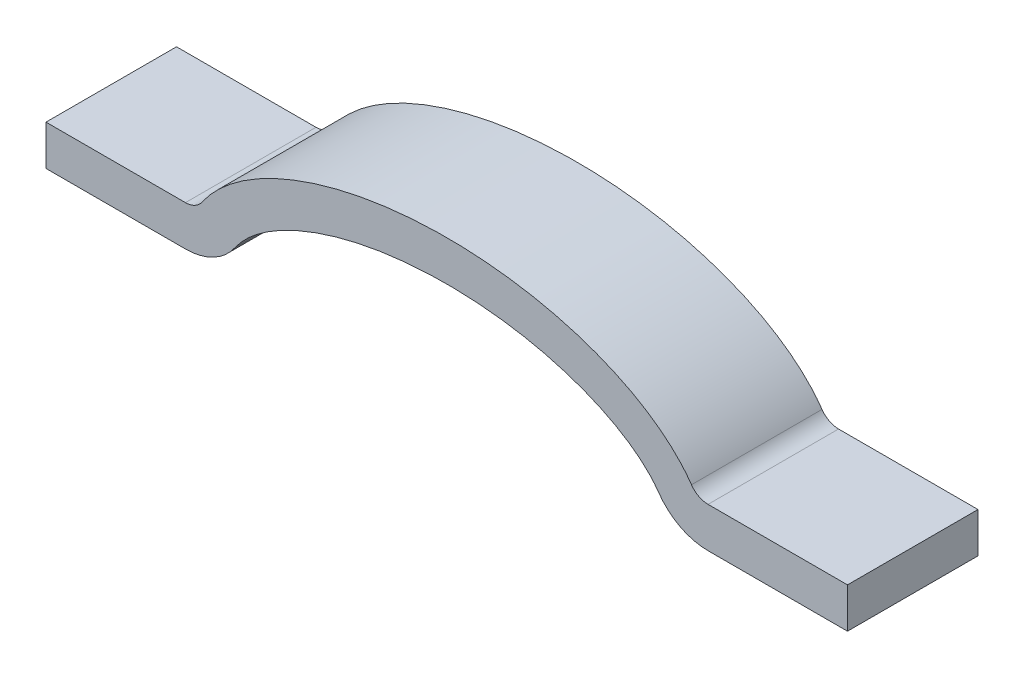
ISO-10303-21;
HEADER;
FILE_DESCRIPTION(('STEP AP214'),'2;1');
FILE_NAME('part.step','',(''),(''),'','','');
FILE_SCHEMA(('AUTOMOTIVE_DESIGN { 1 0 10303 214 1 1 1 1 }'));
ENDSEC;
DATA;
#1=APPLICATION_CONTEXT('core data for automotive mechanical design processes');
#2=APPLICATION_PROTOCOL_DEFINITION('international standard','automotive_design',2000,#1);
#3=PRODUCT_CONTEXT('',#1,'mechanical');
#4=PRODUCT('Part','Part','',(#3));
#5=PRODUCT_RELATED_PRODUCT_CATEGORY('part','',(#4));
#6=PRODUCT_DEFINITION_FORMATION('','',#4);
#7=PRODUCT_DEFINITION_CONTEXT('part definition',#1,'design');
#8=PRODUCT_DEFINITION('design','',#6,#7);
#9=PRODUCT_DEFINITION_SHAPE('','',#8);
#10=(LENGTH_UNIT() NAMED_UNIT(*) SI_UNIT(.MILLI.,.METRE.));
#11=(NAMED_UNIT(*) PLANE_ANGLE_UNIT() SI_UNIT($,.RADIAN.));
#12=(NAMED_UNIT(*) SI_UNIT($,.STERADIAN.) SOLID_ANGLE_UNIT());
#13=UNCERTAINTY_MEASURE_WITH_UNIT(LENGTH_MEASURE(1.E-05),#10,'distance_accuracy_value','');
#14=(GEOMETRIC_REPRESENTATION_CONTEXT(3) GLOBAL_UNCERTAINTY_ASSIGNED_CONTEXT((#13)) GLOBAL_UNIT_ASSIGNED_CONTEXT((#10,
#11,#12)) REPRESENTATION_CONTEXT('',''));
#15=CARTESIAN_POINT('',(0.,0.,0.));
#16=DIRECTION('',(0.,0.,1.));
#17=DIRECTION('',(1.,0.,0.));
#18=AXIS2_PLACEMENT_3D('',#15,#16,#17);
#19=CARTESIAN_POINT('',(39.9161860349977,0.,13.));
#20=DIRECTION('',(1.,0.,0.));
#21=DIRECTION('',(0.,0.,-1.));
#22=AXIS2_PLACEMENT_3D('',#19,#20,#21);
#23=PLANE('',#22);
#24=DIRECTION('',(0.,-1.,0.));
#25=VECTOR('',#24,1.);
#26=CARTESIAN_POINT('',(39.9161860349977,0.,0.));
#27=LINE('',#26,#25);
#28=CARTESIAN_POINT('',(39.9161860349977,4.,0.));
#29=VERTEX_POINT('',#28);
#30=CARTESIAN_POINT('',(39.9161860349977,0.,0.));
#31=VERTEX_POINT('',#30);
#32=EDGE_CURVE('E11',#29,#31,#27,.T.);
#33=ORIENTED_EDGE('',*,*,#32,.F.);
#34=DIRECTION('',(0.,0.,1.));
#35=VECTOR('',#34,1.);
#36=CARTESIAN_POINT('',(39.9161860349977,4.,13.));
#37=LINE('',#36,#35);
#38=CARTESIAN_POINT('',(39.9161860349977,4.,13.));
#39=VERTEX_POINT('',#38);
#40=EDGE_CURVE('E108',#39,#29,#37,.F.);
#41=ORIENTED_EDGE('',*,*,#40,.F.);
#42=DIRECTION('',(0.,-1.,0.));
#43=VECTOR('',#42,1.);
#44=CARTESIAN_POINT('',(39.9161860349977,0.,13.));
#45=LINE('',#44,#43);
#46=CARTESIAN_POINT('',(39.9161860349977,0.,13.));
#47=VERTEX_POINT('',#46);
#48=EDGE_CURVE('E46',#39,#47,#45,.T.);
#49=ORIENTED_EDGE('',*,*,#48,.T.);
#50=DIRECTION('',(0.,0.,-1.));
#51=VECTOR('',#50,1.);
#52=CARTESIAN_POINT('',(39.9161860349977,0.,13.));
#53=LINE('',#52,#51);
#54=EDGE_CURVE('E140',#47,#31,#53,.T.);
#55=ORIENTED_EDGE('',*,*,#54,.T.);
#56=EDGE_LOOP('',(#33,#41,#49,#55));
#57=FACE_BOUND('',#56,.T.);
#58=ADVANCED_FACE('F37',(#57),#23,.T.);
#59=CARTESIAN_POINT('',(-22.,0.,13.));
#60=DIRECTION('',(0.,0.,1.));
#61=DIRECTION('',(1.,0.,0.));
#62=AXIS2_PLACEMENT_3D('',#59,#60,#61);
#63=PLANE('',#62);
#64=DIRECTION('',(1.,0.,0.));
#65=VECTOR('',#64,1.);
#66=CARTESIAN_POINT('',(-22.,0.,13.));
#67=LINE('',#66,#65);
#68=CARTESIAN_POINT('',(-39.9161860349977,0.,13.));
#69=VERTEX_POINT('',#68);
#70=CARTESIAN_POINT('',(-26.0263948261629,0.,13.));
#71=VERTEX_POINT('',#70);
#72=EDGE_CURVE('E163',#69,#71,#67,.T.);
#73=ORIENTED_EDGE('',*,*,#72,.T.);
#74=CARTESIAN_POINT('',(-26.0263948261629,5.99999999999997,13.));
#75=DIRECTION('',(0.,0.,-1.));
#76=DIRECTION('',(-1.,0.,0.));
#77=AXIS2_PLACEMENT_3D('',#74,#75,#76);
#78=CIRCLE('',#77,6.);
#79=CARTESIAN_POINT('',(-21.083393892477,2.59900870780584,13.));
#80=VERTEX_POINT('',#79);
#81=EDGE_CURVE('E54',#71,#80,#78,.F.);
#82=ORIENTED_EDGE('',*,*,#81,.T.);
#83=CARTESIAN_POINT('',(-22.,0.,13.));
#84=CARTESIAN_POINT('',(-22.,0.432036641839711,13.));
#85=CARTESIAN_POINT('',(-21.8548863619666,1.29610992551914,13.));
#86=CARTESIAN_POINT('',(-20.9973878430744,2.88664464705841,13.));
#87=CARTESIAN_POINT('',(-19.2580049467167,4.66938679657808,13.));
#88=CARTESIAN_POINT('',(-15.7412521676776,6.99878575691308,13.));
#89=CARTESIAN_POINT('',(-9.3643610379705,9.3281522587363,13.));
#90=CARTESIAN_POINT('',(0.,10.3359238706319,13.));
#91=CARTESIAN_POINT('',(9.36436103797051,9.3281522587363,13.));
#92=CARTESIAN_POINT('',(15.7412521676776,6.99878575691308,13.));
#93=CARTESIAN_POINT('',(19.2580049467167,4.66938679657808,13.));
#94=CARTESIAN_POINT('',(20.9973878430744,2.8866446470584,13.));
#95=CARTESIAN_POINT('',(21.8548863619666,1.29610992551914,13.));
#96=CARTESIAN_POINT('',(22.,0.432036641839715,13.));
#97=CARTESIAN_POINT('',(22.,0.,13.));
#98=B_SPLINE_CURVE_WITH_KNOTS('',3,(#83,#84,#85,#86,#87,#88,#89,#90,#91,#92,#93,#94,#95,#96,
#97),.UNSPECIFIED.,.F.,.F.,(4,1,1,1,1,1,1,1,1,1,1,1,4),(3.14159265358979,3.33794219443916,
3.53429173528852,3.73064127613788,3.92699081698724,4.31968989868597,4.71238898038469,
5.10508806208341,5.49778714378214,5.6941366846315,5.89048622548086,6.08683576633022,
6.28318530717959),.UNSPECIFIED.);
#99=CARTESIAN_POINT('',(21.083393892477,2.59900870780584,13.));
#100=VERTEX_POINT('',#99);
#101=EDGE_CURVE('E164',#80,#100,#98,.T.);
#102=ORIENTED_EDGE('',*,*,#101,.T.);
#103=CARTESIAN_POINT('',(26.0263948261629,5.99999999999997,13.));
#104=DIRECTION('',(0.,0.,-1.));
#105=DIRECTION('',(-1.,0.,0.));
#106=AXIS2_PLACEMENT_3D('',#103,#104,#105);
#107=CIRCLE('',#106,6.);
#108=CARTESIAN_POINT('',(26.0263948261629,0.,13.));
#109=VERTEX_POINT('',#108);
#110=EDGE_CURVE('E161',#100,#109,#107,.F.);
#111=ORIENTED_EDGE('',*,*,#110,.T.);
#112=DIRECTION('',(1.,0.,0.));
#113=VECTOR('',#112,1.);
#114=CARTESIAN_POINT('',(22.,0.,13.));
#115=LINE('',#114,#113);
#116=EDGE_CURVE('E152',#109,#47,#115,.T.);
#117=ORIENTED_EDGE('',*,*,#116,.T.);
#118=ORIENTED_EDGE('',*,*,#48,.F.);
#119=DIRECTION('',(-1.,0.,0.));
#120=VECTOR('',#119,1.);
#121=CARTESIAN_POINT('',(22.,4.,13.));
#122=LINE('',#121,#120);
#123=CARTESIAN_POINT('',(26.0263948261629,4.,13.));
#124=VERTEX_POINT('',#123);
#125=EDGE_CURVE('E232',#124,#39,#122,.F.);
#126=ORIENTED_EDGE('',*,*,#125,.F.);
#127=CARTESIAN_POINT('',(26.0263948261629,5.99999999999997,13.));
#128=DIRECTION('',(0.,0.,-1.));
#129=DIRECTION('',(-1.,0.,0.));
#130=AXIS2_PLACEMENT_3D('',#127,#128,#129);
#131=CIRCLE('',#130,2.);
#132=CARTESIAN_POINT('',(24.3787278482676,4.86633623593526,13.));
#133=VERTEX_POINT('',#132);
#134=EDGE_CURVE('E103',#133,#124,#131,.F.);
#135=ORIENTED_EDGE('',*,*,#134,.F.);
#136=CARTESIAN_POINT('',(-26.,-5.25591541948676E-09,13.));
#137=CARTESIAN_POINT('',(-26.0000116676451,0.111537247286349,13.));
#138=CARTESIAN_POINT('',(-25.9976258289216,0.223078285323674,13.));
#139=CARTESIAN_POINT('',(-25.9878872850968,0.448666430823199,13.));
#140=CARTESIAN_POINT('',(-25.9804149655458,0.56270837405115,13.));
#141=CARTESIAN_POINT('',(-25.9601396738284,0.792413314224165,13.));
#142=CARTESIAN_POINT('',(-25.9472420470309,0.908067983077297,13.));
#143=CARTESIAN_POINT('',(-25.915945897434,1.14006903279323,13.));
#144=CARTESIAN_POINT('',(-25.8974821013963,1.25640660479358,13.));
#145=CARTESIAN_POINT('',(-25.8550595671101,1.48888395466193,13.));
#146=CARTESIAN_POINT('',(-25.8310646704827,1.6050171275041,13.));
#147=CARTESIAN_POINT('',(-25.7777484707093,1.83630999130887,13.));
#148=CARTESIAN_POINT('',(-25.7484160494636,1.95146711504999,13.));
#149=CARTESIAN_POINT('',(-25.6847150602839,2.18020284317876,13.));
#150=CARTESIAN_POINT('',(-25.6503536260085,2.29378343805561,13.));
#151=CARTESIAN_POINT('',(-25.576956710448,2.51896209143195,13.));
#152=CARTESIAN_POINT('',(-25.5379387429657,2.63056587201652,13.));
#153=CARTESIAN_POINT('',(-25.4552024021435,2.85270133325781,13.));
#154=CARTESIAN_POINT('',(-25.4114597755304,2.96322396550021,13.));
#155=CARTESIAN_POINT('',(-25.3189473938992,3.18415346660159,13.));
#156=CARTESIAN_POINT('',(-25.2701104006534,3.2945321547338,13.));
#157=CARTESIAN_POINT('',(-25.1674048004263,3.5150226557403,13.));
#158=CARTESIAN_POINT('',(-25.1134695287242,3.62510338377648,13.));
#159=CARTESIAN_POINT('',(-25.0005687603073,3.84486090717794,13.));
#160=CARTESIAN_POINT('',(-24.9415371214083,3.9545036889688,13.));
#161=CARTESIAN_POINT('',(-24.8184478876507,4.17326325245095,13.));
#162=CARTESIAN_POINT('',(-24.7543245859132,4.28234302730507,13.));
#163=CARTESIAN_POINT('',(-24.6210568142596,4.49987062809492,13.));
#164=CARTESIAN_POINT('',(-24.551846981188,4.60827837147226,13.));
#165=CARTESIAN_POINT('',(-24.4084091092638,4.82437233822117,13.));
#166=CARTESIAN_POINT('',(-24.3341159707699,4.93201530889777,13.));
#167=CARTESIAN_POINT('',(-24.1805098064464,5.1465060090048,13.));
#168=CARTESIAN_POINT('',(-24.1011318763264,5.25330721555847,13.));
#169=CARTESIAN_POINT('',(-23.9376358793378,5.465685050551,13.));
#170=CARTESIAN_POINT('',(-23.8534658733088,5.57122165086724,13.));
#171=CARTESIAN_POINT('',(-23.6806810325843,5.78080997511271,13.));
#172=CARTESIAN_POINT('',(-23.5920238340478,5.88482672709309,13.));
#173=CARTESIAN_POINT('',(-23.4102450544272,6.09150776484632,13.));
#174=CARTESIAN_POINT('',(-23.3170780484472,6.19413207563363,13.));
#175=CARTESIAN_POINT('',(-23.1262558984359,6.39810968013806,13.));
#176=CARTESIAN_POINT('',(-23.0285536250027,6.49941876570225,13.));
#177=CARTESIAN_POINT('',(-22.7261165515322,6.80408823826286,13.));
#178=CARTESIAN_POINT('',(-22.5167459416307,7.00287359830188,13.));
#179=CARTESIAN_POINT('',(-22.0798868853556,7.39575577415625,13.));
#180=CARTESIAN_POINT('',(-21.8520176546229,7.58942688279915,13.));
#181=CARTESIAN_POINT('',(-21.3789946630926,7.97090126508661,13.));
#182=CARTESIAN_POINT('',(-21.13351925821,8.15830480213568,13.));
#183=CARTESIAN_POINT('',(-20.6264401691121,8.52651690174705,13.));
#184=CARTESIAN_POINT('',(-20.3645738543199,8.7069625142317,13.));
#185=CARTESIAN_POINT('',(-19.8247588027536,9.06125072564397,13.));
#186=CARTESIAN_POINT('',(-19.546563156856,9.2347161911291,13.));
#187=CARTESIAN_POINT('',(-18.9741946965365,9.57474769189839,13.));
#188=CARTESIAN_POINT('',(-18.6797941952976,9.74092968282077,13.));
#189=CARTESIAN_POINT('',(-18.0763789806,10.0652540159631,13.));
#190=CARTESIAN_POINT('',(-17.7671841379604,10.2230603717114,13.));
#191=CARTESIAN_POINT('',(-17.1358146082921,10.5301159281395,13.));
#192=CARTESIAN_POINT('',(-16.8135048236157,10.6790864692833,13.));
#193=CARTESIAN_POINT('',(-16.1563567979412,10.9685343106685,13.));
#194=CARTESIAN_POINT('',(-15.8214002132375,11.1087422747537,13.));
#195=CARTESIAN_POINT('',(-15.1394655070584,11.380573016466,13.));
#196=CARTESIAN_POINT('',(-14.7923851076409,11.5119386431155,13.));
#197=CARTESIAN_POINT('',(-14.086757023152,11.7658746909795,13.));
#198=CARTESIAN_POINT('',(-13.7281218143803,11.88820144439,13.));
#199=CARTESIAN_POINT('',(-12.9999804917653,12.1237597026379,13.));
#200=CARTESIAN_POINT('',(-12.6304001582384,12.2367614083769,13.));
#201=CARTESIAN_POINT('',(-11.8810004293432,12.4532996975759,13.));
#202=CARTESIAN_POINT('',(-11.501118686008,12.5566202125045,13.));
#203=CARTESIAN_POINT('',(-10.7317776314485,12.7533690968808,13.));
#204=CARTESIAN_POINT('',(-10.3422665196632,12.846594671185,13.));
#205=CARTESIAN_POINT('',(-9.55512700269836,13.0225123751248,13.));
#206=CARTESIAN_POINT('',(-9.15746143610106,13.1050381251034,13.));
#207=CARTESIAN_POINT('',(-8.35560256669944,13.2593762182577,13.));
#208=CARTESIAN_POINT('',(-7.95138522936855,13.331062741599,13.));
#209=CARTESIAN_POINT('',(-6.72488526673784,13.5309431058362,13.));
#210=CARTESIAN_POINT('',(-5.89967836668501,13.6415405098872,13.));
#211=CARTESIAN_POINT('',(-4.23333341247432,13.8198639361473,13.));
#212=CARTESIAN_POINT('',(-3.39213171827096,13.8869837014631,13.));
#213=CARTESIAN_POINT('',(-1.70063272261015,13.9772291723469,13.));
#214=CARTESIAN_POINT('',(-0.850316361305075,14.,13.));
#215=CARTESIAN_POINT('',(0.850316361304433,14.,13.));
#216=CARTESIAN_POINT('',(1.70063272260886,13.977229172347,13.));
#217=CARTESIAN_POINT('',(3.39213171826967,13.8869837014632,13.));
#218=CARTESIAN_POINT('',(4.23333341247369,13.8198639361473,13.));
#219=CARTESIAN_POINT('',(5.89967836667695,13.6415405098881,13.));
#220=CARTESIAN_POINT('',(6.72488526672175,13.5309431058383,13.));
#221=CARTESIAN_POINT('',(7.95138522934303,13.3310627416034,13.));
#222=CARTESIAN_POINT('',(8.35560256667242,13.2593762182626,13.));
#223=CARTESIAN_POINT('',(9.15746143609327,13.1050381251052,13.));
#224=CARTESIAN_POINT('',(9.55512700271117,13.0225123751223,13.));
#225=CARTESIAN_POINT('',(10.342266519711,12.846594671174,13.));
#226=CARTESIAN_POINT('',(10.7317776315108,12.7533690968658,13.));
#227=CARTESIAN_POINT('',(11.5011186860734,12.556620212487,13.));
#228=CARTESIAN_POINT('',(11.8810004293976,12.4532996975607,13.));
#229=CARTESIAN_POINT('',(12.6304001582672,12.2367614083681,13.));
#230=CARTESIAN_POINT('',(12.9999804917797,12.1237597026333,13.));
#231=CARTESIAN_POINT('',(13.7281218143619,11.888201444396,13.));
#232=CARTESIAN_POINT('',(14.0867570231153,11.7658746909921,13.));
#233=CARTESIAN_POINT('',(14.7923851076046,11.5119386431292,13.));
#234=CARTESIAN_POINT('',(15.1394655070404,11.3805730164732,13.));
#235=CARTESIAN_POINT('',(15.8214002133122,11.1087422747239,13.));
#236=CARTESIAN_POINT('',(16.1563567980896,10.9685343106064,13.));
#237=CARTESIAN_POINT('',(16.8135048237357,10.6790864692273,13.));
#238=CARTESIAN_POINT('',(17.1358146083127,10.5301159281282,13.));
#239=CARTESIAN_POINT('',(17.7671841378536,10.2230603717646,13.));
#240=CARTESIAN_POINT('',(18.0763789804637,10.0652540160334,13.));
#241=CARTESIAN_POINT('',(18.6797941951791,9.74092968288742,13.));
#242=CARTESIAN_POINT('',(18.9741946964635,9.57474769194123,13.));
#243=CARTESIAN_POINT('',(19.5465631567266,9.23471619120654,13.));
#244=CARTESIAN_POINT('',(19.8247588025261,9.06125072578613,13.));
#245=CARTESIAN_POINT('',(20.3645738540333,8.70696251442677,13.));
#246=CARTESIAN_POINT('',(20.6264401688605,8.52651690192429,13.));
#247=CARTESIAN_POINT('',(21.1335192580166,8.1583048022814,13.));
#248=CARTESIAN_POINT('',(21.3789946629229,7.97090126521917,13.));
#249=CARTESIAN_POINT('',(21.8520176544375,7.58942688295277,13.));
#250=CARTESIAN_POINT('',(22.0798868851335,7.3957557743473,13.));
#251=CARTESIAN_POINT('',(22.5167459416699,7.00287359827503,13.));
#252=CARTESIAN_POINT('',(22.7261165518533,6.80408823796273,13.));
#253=CARTESIAN_POINT('',(23.0285536251686,6.49941876552382,13.));
#254=CARTESIAN_POINT('',(23.126255898194,6.3981096803828,13.));
#255=CARTESIAN_POINT('',(23.3170780480187,6.19413207610534,13.));
#256=CARTESIAN_POINT('',(23.4102450542003,6.09150776510358,13.));
#257=CARTESIAN_POINT('',(23.5920238341204,5.88482672701131,13.));
#258=CARTESIAN_POINT('',(23.6806810327581,5.78080997490921,13.));
#259=CARTESIAN_POINT('',(23.8534658733679,5.5712216507883,13.));
#260=CARTESIAN_POINT('',(23.9376358791933,5.4656850507284,13.));
#261=CARTESIAN_POINT('',(24.1011318761151,5.25330721584322,13.));
#262=CARTESIAN_POINT('',(24.1805098063578,5.14650600912951,13.));
#263=CARTESIAN_POINT('',(24.3341159706946,4.93201530900185,13.));
#264=CARTESIAN_POINT('',(24.40840910909,4.82437233847237,13.));
#265=CARTESIAN_POINT('',(24.5518469807964,4.60827837207256,13.));
#266=CARTESIAN_POINT('',(24.6210568137503,4.49987062889827,13.));
#267=CARTESIAN_POINT('',(24.7543245855127,4.28234302798651,13.));
#268=CARTESIAN_POINT('',(24.8184478874569,4.17326325279536,13.));
#269=CARTESIAN_POINT('',(24.9415371216399,3.95450368855732,13.));
#270=CARTESIAN_POINT('',(25.000568760755,3.84486090634631,13.));
#271=CARTESIAN_POINT('',(25.1134695291365,3.62510338293474,13.));
#272=CARTESIAN_POINT('',(25.1674048006193,3.51502265532528,13.));
#273=CARTESIAN_POINT('',(25.2701104007492,3.29453215452878,13.));
#274=CARTESIAN_POINT('',(25.3189473940913,3.18415346616786,13.));
#275=CARTESIAN_POINT('',(25.4114597756033,2.96322396530142,13.));
#276=CARTESIAN_POINT('',(25.4552024020288,2.85270133353429,13.));
#277=CARTESIAN_POINT('',(25.5379387427875,2.63056587252623,13.));
#278=CARTESIAN_POINT('',(25.5769567103644,2.51896209168857,13.));
#279=CARTESIAN_POINT('',(25.6503536260101,2.29378343805051,13.));
#280=CARTESIAN_POINT('',(25.684715060287,2.18020284316853,13.));
#281=CARTESIAN_POINT('',(25.7484160493808,1.95146711534656,13.));
#282=CARTESIAN_POINT('',(25.7777484705532,1.83630999192129,13.));
#283=CARTESIAN_POINT('',(25.83106467028,1.60501712844776,13.));
#284=CARTESIAN_POINT('',(25.8550595669203,1.48888395561773,13.));
#285=CARTESIAN_POINT('',(25.8974821012935,1.25640660544136,13.));
#286=CARTESIAN_POINT('',(25.9159458973902,1.14006903311805,13.));
#287=CARTESIAN_POINT('',(25.9472420469846,0.908067983421301,13.));
#288=CARTESIAN_POINT('',(25.9601396737515,0.792413314914489,13.));
#289=CARTESIAN_POINT('',(25.9804149655618,0.562708374048563,13.));
#290=CARTESIAN_POINT('',(25.9878872851732,0.448666429775861,13.));
#291=CARTESIAN_POINT('',(25.9976258289061,0.223078284976777,13.));
#292=CARTESIAN_POINT('',(26.0000116675999,0.111537248689892,13.));
#293=CARTESIAN_POINT('',(26.,-2.10236242051774E-09,13.));
#294=B_SPLINE_CURVE_WITH_KNOTS('',3,(#136,#137,#138,#139,#140,#141,#142,#143,#144,#145,#146,
#147,#148,#149,#150,#151,#152,#153,#154,#155,#156,#157,#158,#159,#160,#161,#162,#163,#164,#165,
#166,#167,#168,#169,#170,#171,#172,#173,#174,#175,#176,#177,#178,#179,#180,#181,#182,#183,#184,
#185,#186,#187,#188,#189,#190,#191,#192,#193,#194,#195,#196,#197,#198,#199,#200,#201,#202,#203,
#204,#205,#206,#207,#208,#209,#210,#211,#212,#213,#214,#215,#216,#217,#218,#219,#220,#221,#222,
#223,#224,#225,#226,#227,#228,#229,#230,#231,#232,#233,#234,#235,#236,#237,#238,#239,#240,#241,
#242,#243,#244,#245,#246,#247,#248,#249,#250,#251,#252,#253,#254,#255,#256,#257,#258,#259,#260,
#261,#262,#263,#264,#265,#266,#267,#268,#269,#270,#271,#272,#273,#274,#275,#276,#277,#278,#279,
#280,#281,#282,#283,#284,#285,#286,#287,#288,#289,#290,#291,#292,#293),.UNSPECIFIED.,.F.,.F.,(4,
2,2,2,2,2,2,2,2,2,2,2,2,2,2,2,2,2,2,2,2,2,2,2,2,2,2,2,2,2,2,2,2,2,2,2,2,2,2,2,2,2,2,2,2,2,2,2,2,
2,2,2,2,2,2,2,2,2,2,2,2,2,2,2,2,2,2,2,2,2,2,2,2,2,2,2,2,2,4),(0.,0.334591789746542,
0.677336812858055,1.02632737627372,1.37958114205443,1.73521322792134,2.09159475891316,
2.44747557596909,2.80205773509361,3.1585553708871,3.52056192024408,3.88822160551874,
4.26170458649938,4.64121147442852,5.02697649710909,5.41926944722264,5.8183965570049,
6.22329407200158,6.63324503470354,7.04899786213921,7.47118101830255,8.33679232254686,
9.2335334475586,10.1596351408929,11.1133345604709,12.0965467306585,13.1104308997004,
14.1515568356346,15.2165209576283,16.3056441657962,17.4187588005548,18.5553293801477,
19.7145470935532,20.8954045060722,22.0967554563243,23.3149837249181,24.5464165421089,
27.0427967760967,29.5732773915513,32.1239249127651,34.6745724339769,37.2050530494334,
39.7014332833969,40.932866100583,42.15109436924,43.352445319537,44.5333027320222,
45.6925204453825,46.8290910249172,47.9422056597339,49.031328868143,50.0962929898102,
51.1374189256425,52.1513030948383,53.1345152646738,54.0882146843685,55.014316377783,
55.9110575026386,56.7766688080581,57.1988519624594,57.6146047907775,58.024555753954,
58.4294532679691,58.8285803783557,59.2208733279385,59.6066383499161,59.9861452390305,
60.3596282214272,60.7272879052643,61.0892944553647,61.4457920896268,61.8003742495608,
62.1562550666327,62.512636596653,62.8682686824921,63.2215224492561,63.5705130116307,
63.9132580378779,64.247849822377),.UNSPECIFIED.);
#295=CARTESIAN_POINT('',(-24.3787278482676,4.86633623593526,13.));
#296=VERTEX_POINT('',#295);
#297=EDGE_CURVE('E227',#296,#133,#294,.T.);
#298=ORIENTED_EDGE('',*,*,#297,.F.);
#299=CARTESIAN_POINT('',(-26.0263948261629,5.99999999999997,13.));
#300=DIRECTION('',(0.,0.,-1.));
#301=DIRECTION('',(-1.,0.,0.));
#302=AXIS2_PLACEMENT_3D('',#299,#300,#301);
#303=CIRCLE('',#302,2.);
#304=CARTESIAN_POINT('',(-26.0263948261629,3.99999999999997,13.));
#305=VERTEX_POINT('',#304);
#306=EDGE_CURVE('E233',#305,#296,#303,.F.);
#307=ORIENTED_EDGE('',*,*,#306,.F.);
#308=DIRECTION('',(-1.,0.,0.));
#309=VECTOR('',#308,1.);
#310=CARTESIAN_POINT('',(-22.,4.,13.));
#311=LINE('',#310,#309);
#312=CARTESIAN_POINT('',(-39.9161860349977,4.,13.));
#313=VERTEX_POINT('',#312);
#314=EDGE_CURVE('E241',#313,#305,#311,.F.);
#315=ORIENTED_EDGE('',*,*,#314,.F.);
#316=DIRECTION('',(0.,-1.,0.));
#317=VECTOR('',#316,1.);
#318=CARTESIAN_POINT('',(-39.9161860349977,0.,13.));
#319=LINE('',#318,#317);
#320=EDGE_CURVE('E132',#313,#69,#319,.T.);
#321=ORIENTED_EDGE('',*,*,#320,.T.);
#322=EDGE_LOOP('',(#73,#82,#102,#111,#117,#118,#126,#135,#298,#307,#315,#321));
#323=FACE_BOUND('',#322,.T.);
#324=ADVANCED_FACE('F159',(#323),#63,.T.);
#325=CARTESIAN_POINT('',(-39.9161860349977,0.,13.));
#326=DIRECTION('',(1.,0.,0.));
#327=DIRECTION('',(0.,0.,-1.));
#328=AXIS2_PLACEMENT_3D('',#325,#326,#327);
#329=PLANE('',#328);
#330=ORIENTED_EDGE('',*,*,#320,.F.);
#331=DIRECTION('',(0.,0.,1.));
#332=VECTOR('',#331,1.);
#333=CARTESIAN_POINT('',(-39.9161860349977,4.,13.));
#334=LINE('',#333,#332);
#335=CARTESIAN_POINT('',(-39.9161860349977,4.,0.));
#336=VERTEX_POINT('',#335);
#337=EDGE_CURVE('E242',#313,#336,#334,.F.);
#338=ORIENTED_EDGE('',*,*,#337,.T.);
#339=DIRECTION('',(0.,-1.,0.));
#340=VECTOR('',#339,1.);
#341=CARTESIAN_POINT('',(-39.9161860349977,0.,0.));
#342=LINE('',#341,#340);
#343=CARTESIAN_POINT('',(-39.9161860349977,0.,0.));
#344=VERTEX_POINT('',#343);
#345=EDGE_CURVE('E129',#336,#344,#342,.T.);
#346=ORIENTED_EDGE('',*,*,#345,.T.);
#347=DIRECTION('',(0.,0.,-1.));
#348=VECTOR('',#347,1.);
#349=CARTESIAN_POINT('',(-39.9161860349977,0.,13.));
#350=LINE('',#349,#348);
#351=EDGE_CURVE('E157',#69,#344,#350,.T.);
#352=ORIENTED_EDGE('',*,*,#351,.F.);
#353=EDGE_LOOP('',(#330,#338,#346,#352));
#354=FACE_BOUND('',#353,.T.);
#355=ADVANCED_FACE('F267',(#354),#329,.F.);
#356=CARTESIAN_POINT('',(26.0263948261629,5.99999999999997,0.));
#357=DIRECTION('',(0.,0.,1.));
#358=DIRECTION('',(1.,0.,0.));
#359=AXIS2_PLACEMENT_3D('',#356,#357,#358);
#360=PLANE('',#359);
#361=CARTESIAN_POINT('',(26.0263948261629,5.99999999999997,0.));
#362=DIRECTION('',(0.,0.,-1.));
#363=DIRECTION('',(-1.,0.,0.));
#364=AXIS2_PLACEMENT_3D('',#361,#362,#363);
#365=CIRCLE('',#364,2.);
#366=CARTESIAN_POINT('',(26.0263948261629,3.99999999999997,0.));
#367=VERTEX_POINT('',#366);
#368=CARTESIAN_POINT('',(24.3787278482676,4.86633623593526,0.));
#369=VERTEX_POINT('',#368);
#370=EDGE_CURVE('E100',#367,#369,#365,.T.);
#371=ORIENTED_EDGE('',*,*,#370,.F.);
#372=DIRECTION('',(-1.,0.,0.));
#373=VECTOR('',#372,1.);
#374=CARTESIAN_POINT('',(22.,4.,0.));
#375=LINE('',#374,#373);
#376=EDGE_CURVE('E112',#367,#29,#375,.F.);
#377=ORIENTED_EDGE('',*,*,#376,.T.);
#378=ORIENTED_EDGE('',*,*,#32,.T.);
#379=DIRECTION('',(1.,0.,0.));
#380=VECTOR('',#379,1.);
#381=CARTESIAN_POINT('',(22.,0.,0.));
#382=LINE('',#381,#380);
#383=CARTESIAN_POINT('',(26.0263948261629,0.,0.));
#384=VERTEX_POINT('',#383);
#385=EDGE_CURVE('E155',#384,#31,#382,.T.);
#386=ORIENTED_EDGE('',*,*,#385,.F.);
#387=CARTESIAN_POINT('',(26.0263948261629,5.99999999999997,0.));
#388=DIRECTION('',(0.,0.,-1.));
#389=DIRECTION('',(-1.,0.,0.));
#390=AXIS2_PLACEMENT_3D('',#387,#388,#389);
#391=CIRCLE('',#390,6.);
#392=CARTESIAN_POINT('',(21.083393892477,2.59900870780584,0.));
#393=VERTEX_POINT('',#392);
#394=EDGE_CURVE('E188',#384,#393,#391,.T.);
#395=ORIENTED_EDGE('',*,*,#394,.T.);
#396=CARTESIAN_POINT('',(-22.,0.,0.));
#397=CARTESIAN_POINT('',(-22.,0.432036641839711,0.));
#398=CARTESIAN_POINT('',(-21.8548863619666,1.29610992551914,0.));
#399=CARTESIAN_POINT('',(-20.9973878430744,2.88664464705841,0.));
#400=CARTESIAN_POINT('',(-19.2580049467167,4.66938679657808,0.));
#401=CARTESIAN_POINT('',(-15.7412521676776,6.99878575691308,0.));
#402=CARTESIAN_POINT('',(-9.3643610379705,9.3281522587363,0.));
#403=CARTESIAN_POINT('',(0.,10.3359238706319,0.));
#404=CARTESIAN_POINT('',(9.36436103797051,9.3281522587363,0.));
#405=CARTESIAN_POINT('',(15.7412521676776,6.99878575691308,0.));
#406=CARTESIAN_POINT('',(19.2580049467167,4.66938679657808,0.));
#407=CARTESIAN_POINT('',(20.9973878430744,2.8866446470584,0.));
#408=CARTESIAN_POINT('',(21.8548863619666,1.29610992551914,0.));
#409=CARTESIAN_POINT('',(22.,0.432036641839715,0.));
#410=CARTESIAN_POINT('',(22.,0.,0.));
#411=B_SPLINE_CURVE_WITH_KNOTS('',3,(#396,#397,#398,#399,#400,#401,#402,#403,#404,#405,#406,
#407,#408,#409,#410),.UNSPECIFIED.,.F.,.F.,(4,1,1,1,1,1,1,1,1,1,1,1,4),(3.14159265358979,
3.33794219443916,3.53429173528852,3.73064127613788,3.92699081698724,4.31968989868597,
4.71238898038469,5.10508806208341,5.49778714378214,5.6941366846315,5.89048622548086,
6.08683576633022,6.28318530717959),.UNSPECIFIED.);
#412=CARTESIAN_POINT('',(-21.083393892477,2.59900870780584,0.));
#413=VERTEX_POINT('',#412);
#414=EDGE_CURVE('E170',#413,#393,#411,.T.);
#415=ORIENTED_EDGE('',*,*,#414,.F.);
#416=CARTESIAN_POINT('',(-26.0263948261629,5.99999999999997,0.));
#417=DIRECTION('',(0.,0.,-1.));
#418=DIRECTION('',(-1.,0.,0.));
#419=AXIS2_PLACEMENT_3D('',#416,#417,#418);
#420=CIRCLE('',#419,6.);
#421=CARTESIAN_POINT('',(-26.0263948261629,0.,0.));
#422=VERTEX_POINT('',#421);
#423=EDGE_CURVE('E185',#413,#422,#420,.T.);
#424=ORIENTED_EDGE('',*,*,#423,.T.);
#425=DIRECTION('',(1.,0.,0.));
#426=VECTOR('',#425,1.);
#427=CARTESIAN_POINT('',(-22.,0.,0.));
#428=LINE('',#427,#426);
#429=EDGE_CURVE('E167',#344,#422,#428,.T.);
#430=ORIENTED_EDGE('',*,*,#429,.F.);
#431=ORIENTED_EDGE('',*,*,#345,.F.);
#432=DIRECTION('',(-1.,0.,0.));
#433=VECTOR('',#432,1.);
#434=CARTESIAN_POINT('',(-22.,4.,0.));
#435=LINE('',#434,#433);
#436=CARTESIAN_POINT('',(-26.0263948261629,4.,0.));
#437=VERTEX_POINT('',#436);
#438=EDGE_CURVE('E116',#336,#437,#435,.F.);
#439=ORIENTED_EDGE('',*,*,#438,.T.);
#440=CARTESIAN_POINT('',(-26.0263948261629,5.99999999999997,0.));
#441=DIRECTION('',(0.,0.,-1.));
#442=DIRECTION('',(-1.,0.,0.));
#443=AXIS2_PLACEMENT_3D('',#440,#441,#442);
#444=CIRCLE('',#443,2.);
#445=CARTESIAN_POINT('',(-24.3787278482676,4.86633623593526,0.));
#446=VERTEX_POINT('',#445);
#447=EDGE_CURVE('E107',#446,#437,#444,.T.);
#448=ORIENTED_EDGE('',*,*,#447,.F.);
#449=CARTESIAN_POINT('',(-26.,-5.25591541948676E-09,0.));
#450=CARTESIAN_POINT('',(-26.0000116676451,0.111537247286349,0.));
#451=CARTESIAN_POINT('',(-25.9976258289216,0.223078285323674,0.));
#452=CARTESIAN_POINT('',(-25.9878872850968,0.448666430823199,0.));
#453=CARTESIAN_POINT('',(-25.9804149655458,0.56270837405115,0.));
#454=CARTESIAN_POINT('',(-25.9601396738284,0.792413314224165,0.));
#455=CARTESIAN_POINT('',(-25.9472420470309,0.908067983077297,0.));
#456=CARTESIAN_POINT('',(-25.915945897434,1.14006903279323,0.));
#457=CARTESIAN_POINT('',(-25.8974821013963,1.25640660479358,0.));
#458=CARTESIAN_POINT('',(-25.8550595671101,1.48888395466193,0.));
#459=CARTESIAN_POINT('',(-25.8310646704827,1.6050171275041,0.));
#460=CARTESIAN_POINT('',(-25.7777484707093,1.83630999130887,0.));
#461=CARTESIAN_POINT('',(-25.7484160494636,1.95146711504999,0.));
#462=CARTESIAN_POINT('',(-25.6847150602839,2.18020284317876,0.));
#463=CARTESIAN_POINT('',(-25.6503536260085,2.29378343805561,0.));
#464=CARTESIAN_POINT('',(-25.576956710448,2.51896209143195,0.));
#465=CARTESIAN_POINT('',(-25.5379387429657,2.63056587201652,0.));
#466=CARTESIAN_POINT('',(-25.4552024021435,2.85270133325781,0.));
#467=CARTESIAN_POINT('',(-25.4114597755304,2.96322396550021,0.));
#468=CARTESIAN_POINT('',(-25.3189473938992,3.18415346660159,0.));
#469=CARTESIAN_POINT('',(-25.2701104006534,3.2945321547338,0.));
#470=CARTESIAN_POINT('',(-25.1674048004263,3.5150226557403,0.));
#471=CARTESIAN_POINT('',(-25.1134695287242,3.62510338377648,0.));
#472=CARTESIAN_POINT('',(-25.0005687603073,3.84486090717794,0.));
#473=CARTESIAN_POINT('',(-24.9415371214083,3.9545036889688,0.));
#474=CARTESIAN_POINT('',(-24.8184478876507,4.17326325245095,0.));
#475=CARTESIAN_POINT('',(-24.7543245859132,4.28234302730507,0.));
#476=CARTESIAN_POINT('',(-24.6210568142596,4.49987062809492,0.));
#477=CARTESIAN_POINT('',(-24.551846981188,4.60827837147226,0.));
#478=CARTESIAN_POINT('',(-24.4084091092638,4.82437233822117,0.));
#479=CARTESIAN_POINT('',(-24.3341159707699,4.93201530889777,0.));
#480=CARTESIAN_POINT('',(-24.1805098064464,5.1465060090048,0.));
#481=CARTESIAN_POINT('',(-24.1011318763264,5.25330721555847,0.));
#482=CARTESIAN_POINT('',(-23.9376358793378,5.465685050551,0.));
#483=CARTESIAN_POINT('',(-23.8534658733088,5.57122165086724,0.));
#484=CARTESIAN_POINT('',(-23.6806810325843,5.78080997511271,0.));
#485=CARTESIAN_POINT('',(-23.5920238340478,5.88482672709309,0.));
#486=CARTESIAN_POINT('',(-23.4102450544272,6.09150776484632,0.));
#487=CARTESIAN_POINT('',(-23.3170780484472,6.19413207563363,0.));
#488=CARTESIAN_POINT('',(-23.1262558984359,6.39810968013806,0.));
#489=CARTESIAN_POINT('',(-23.0285536250027,6.49941876570225,0.));
#490=CARTESIAN_POINT('',(-22.7261165515322,6.80408823826286,0.));
#491=CARTESIAN_POINT('',(-22.5167459416307,7.00287359830188,0.));
#492=CARTESIAN_POINT('',(-22.0798868853556,7.39575577415625,0.));
#493=CARTESIAN_POINT('',(-21.8520176546229,7.58942688279915,0.));
#494=CARTESIAN_POINT('',(-21.3789946630926,7.97090126508661,0.));
#495=CARTESIAN_POINT('',(-21.13351925821,8.15830480213568,0.));
#496=CARTESIAN_POINT('',(-20.6264401691121,8.52651690174705,0.));
#497=CARTESIAN_POINT('',(-20.3645738543199,8.7069625142317,0.));
#498=CARTESIAN_POINT('',(-19.8247588027536,9.06125072564397,0.));
#499=CARTESIAN_POINT('',(-19.546563156856,9.2347161911291,0.));
#500=CARTESIAN_POINT('',(-18.9741946965365,9.57474769189839,0.));
#501=CARTESIAN_POINT('',(-18.6797941952976,9.74092968282077,0.));
#502=CARTESIAN_POINT('',(-18.0763789806,10.0652540159631,0.));
#503=CARTESIAN_POINT('',(-17.7671841379604,10.2230603717114,0.));
#504=CARTESIAN_POINT('',(-17.1358146082921,10.5301159281395,0.));
#505=CARTESIAN_POINT('',(-16.8135048236157,10.6790864692833,0.));
#506=CARTESIAN_POINT('',(-16.1563567979412,10.9685343106685,0.));
#507=CARTESIAN_POINT('',(-15.8214002132375,11.1087422747537,0.));
#508=CARTESIAN_POINT('',(-15.1394655070584,11.380573016466,0.));
#509=CARTESIAN_POINT('',(-14.7923851076409,11.5119386431155,0.));
#510=CARTESIAN_POINT('',(-14.086757023152,11.7658746909795,0.));
#511=CARTESIAN_POINT('',(-13.7281218143803,11.88820144439,0.));
#512=CARTESIAN_POINT('',(-12.9999804917653,12.1237597026379,0.));
#513=CARTESIAN_POINT('',(-12.6304001582384,12.2367614083769,0.));
#514=CARTESIAN_POINT('',(-11.8810004293432,12.4532996975759,0.));
#515=CARTESIAN_POINT('',(-11.501118686008,12.5566202125045,0.));
#516=CARTESIAN_POINT('',(-10.7317776314485,12.7533690968808,0.));
#517=CARTESIAN_POINT('',(-10.3422665196632,12.846594671185,0.));
#518=CARTESIAN_POINT('',(-9.55512700269836,13.0225123751248,0.));
#519=CARTESIAN_POINT('',(-9.15746143610106,13.1050381251034,0.));
#520=CARTESIAN_POINT('',(-8.35560256669944,13.2593762182577,0.));
#521=CARTESIAN_POINT('',(-7.95138522936855,13.331062741599,0.));
#522=CARTESIAN_POINT('',(-6.72488526673784,13.5309431058362,0.));
#523=CARTESIAN_POINT('',(-5.89967836668501,13.6415405098872,0.));
#524=CARTESIAN_POINT('',(-4.23333341247432,13.8198639361473,0.));
#525=CARTESIAN_POINT('',(-3.39213171827096,13.8869837014631,0.));
#526=CARTESIAN_POINT('',(-1.70063272261015,13.9772291723469,0.));
#527=CARTESIAN_POINT('',(-0.850316361305075,14.,0.));
#528=CARTESIAN_POINT('',(0.850316361304433,14.,0.));
#529=CARTESIAN_POINT('',(1.70063272260886,13.977229172347,0.));
#530=CARTESIAN_POINT('',(3.39213171826967,13.8869837014632,0.));
#531=CARTESIAN_POINT('',(4.23333341247369,13.8198639361473,0.));
#532=CARTESIAN_POINT('',(5.89967836667695,13.6415405098881,0.));
#533=CARTESIAN_POINT('',(6.72488526672175,13.5309431058383,0.));
#534=CARTESIAN_POINT('',(7.95138522934303,13.3310627416034,0.));
#535=CARTESIAN_POINT('',(8.35560256667242,13.2593762182626,0.));
#536=CARTESIAN_POINT('',(9.15746143609327,13.1050381251052,0.));
#537=CARTESIAN_POINT('',(9.55512700271117,13.0225123751223,0.));
#538=CARTESIAN_POINT('',(10.342266519711,12.846594671174,0.));
#539=CARTESIAN_POINT('',(10.7317776315108,12.7533690968658,0.));
#540=CARTESIAN_POINT('',(11.5011186860734,12.556620212487,0.));
#541=CARTESIAN_POINT('',(11.8810004293976,12.4532996975607,0.));
#542=CARTESIAN_POINT('',(12.6304001582672,12.2367614083681,0.));
#543=CARTESIAN_POINT('',(12.9999804917797,12.1237597026333,0.));
#544=CARTESIAN_POINT('',(13.7281218143619,11.888201444396,0.));
#545=CARTESIAN_POINT('',(14.0867570231153,11.7658746909921,0.));
#546=CARTESIAN_POINT('',(14.7923851076046,11.5119386431292,0.));
#547=CARTESIAN_POINT('',(15.1394655070404,11.3805730164732,0.));
#548=CARTESIAN_POINT('',(15.8214002133122,11.1087422747239,0.));
#549=CARTESIAN_POINT('',(16.1563567980896,10.9685343106064,0.));
#550=CARTESIAN_POINT('',(16.8135048237357,10.6790864692273,0.));
#551=CARTESIAN_POINT('',(17.1358146083127,10.5301159281282,0.));
#552=CARTESIAN_POINT('',(17.7671841378536,10.2230603717646,0.));
#553=CARTESIAN_POINT('',(18.0763789804637,10.0652540160334,0.));
#554=CARTESIAN_POINT('',(18.6797941951791,9.74092968288742,0.));
#555=CARTESIAN_POINT('',(18.9741946964635,9.57474769194123,0.));
#556=CARTESIAN_POINT('',(19.5465631567266,9.23471619120654,0.));
#557=CARTESIAN_POINT('',(19.8247588025261,9.06125072578613,0.));
#558=CARTESIAN_POINT('',(20.3645738540333,8.70696251442677,0.));
#559=CARTESIAN_POINT('',(20.6264401688605,8.52651690192429,0.));
#560=CARTESIAN_POINT('',(21.1335192580166,8.1583048022814,0.));
#561=CARTESIAN_POINT('',(21.3789946629229,7.97090126521917,0.));
#562=CARTESIAN_POINT('',(21.8520176544375,7.58942688295277,0.));
#563=CARTESIAN_POINT('',(22.0798868851335,7.3957557743473,0.));
#564=CARTESIAN_POINT('',(22.5167459416699,7.00287359827503,0.));
#565=CARTESIAN_POINT('',(22.7261165518533,6.80408823796273,0.));
#566=CARTESIAN_POINT('',(23.0285536251686,6.49941876552382,0.));
#567=CARTESIAN_POINT('',(23.126255898194,6.3981096803828,0.));
#568=CARTESIAN_POINT('',(23.3170780480187,6.19413207610534,0.));
#569=CARTESIAN_POINT('',(23.4102450542003,6.09150776510358,0.));
#570=CARTESIAN_POINT('',(23.5920238341204,5.88482672701131,0.));
#571=CARTESIAN_POINT('',(23.6806810327581,5.78080997490921,0.));
#572=CARTESIAN_POINT('',(23.8534658733679,5.5712216507883,0.));
#573=CARTESIAN_POINT('',(23.9376358791933,5.4656850507284,0.));
#574=CARTESIAN_POINT('',(24.1011318761151,5.25330721584322,0.));
#575=CARTESIAN_POINT('',(24.1805098063578,5.14650600912951,0.));
#576=CARTESIAN_POINT('',(24.3341159706946,4.93201530900185,0.));
#577=CARTESIAN_POINT('',(24.40840910909,4.82437233847237,0.));
#578=CARTESIAN_POINT('',(24.5518469807964,4.60827837207256,0.));
#579=CARTESIAN_POINT('',(24.6210568137503,4.49987062889827,0.));
#580=CARTESIAN_POINT('',(24.7543245855127,4.28234302798651,0.));
#581=CARTESIAN_POINT('',(24.8184478874569,4.17326325279536,0.));
#582=CARTESIAN_POINT('',(24.9415371216399,3.95450368855732,0.));
#583=CARTESIAN_POINT('',(25.000568760755,3.84486090634631,0.));
#584=CARTESIAN_POINT('',(25.1134695291365,3.62510338293474,0.));
#585=CARTESIAN_POINT('',(25.1674048006193,3.51502265532528,0.));
#586=CARTESIAN_POINT('',(25.2701104007492,3.29453215452878,0.));
#587=CARTESIAN_POINT('',(25.3189473940913,3.18415346616786,0.));
#588=CARTESIAN_POINT('',(25.4114597756033,2.96322396530142,0.));
#589=CARTESIAN_POINT('',(25.4552024020288,2.85270133353429,0.));
#590=CARTESIAN_POINT('',(25.5379387427875,2.63056587252623,0.));
#591=CARTESIAN_POINT('',(25.5769567103644,2.51896209168857,0.));
#592=CARTESIAN_POINT('',(25.6503536260101,2.29378343805051,0.));
#593=CARTESIAN_POINT('',(25.684715060287,2.18020284316853,0.));
#594=CARTESIAN_POINT('',(25.7484160493808,1.95146711534656,0.));
#595=CARTESIAN_POINT('',(25.7777484705532,1.83630999192129,0.));
#596=CARTESIAN_POINT('',(25.83106467028,1.60501712844776,0.));
#597=CARTESIAN_POINT('',(25.8550595669203,1.48888395561773,0.));
#598=CARTESIAN_POINT('',(25.8974821012935,1.25640660544136,0.));
#599=CARTESIAN_POINT('',(25.9159458973902,1.14006903311805,0.));
#600=CARTESIAN_POINT('',(25.9472420469846,0.908067983421301,0.));
#601=CARTESIAN_POINT('',(25.9601396737515,0.792413314914489,0.));
#602=CARTESIAN_POINT('',(25.9804149655618,0.562708374048563,0.));
#603=CARTESIAN_POINT('',(25.9878872851732,0.448666429775861,0.));
#604=CARTESIAN_POINT('',(25.9976258289061,0.223078284976777,0.));
#605=CARTESIAN_POINT('',(26.0000116675999,0.111537248689892,0.));
#606=CARTESIAN_POINT('',(26.,-2.10236242051774E-09,0.));
#607=B_SPLINE_CURVE_WITH_KNOTS('',3,(#449,#450,#451,#452,#453,#454,#455,#456,#457,#458,#459,
#460,#461,#462,#463,#464,#465,#466,#467,#468,#469,#470,#471,#472,#473,#474,#475,#476,#477,#478,
#479,#480,#481,#482,#483,#484,#485,#486,#487,#488,#489,#490,#491,#492,#493,#494,#495,#496,#497,
#498,#499,#500,#501,#502,#503,#504,#505,#506,#507,#508,#509,#510,#511,#512,#513,#514,#515,#516,
#517,#518,#519,#520,#521,#522,#523,#524,#525,#526,#527,#528,#529,#530,#531,#532,#533,#534,#535,
#536,#537,#538,#539,#540,#541,#542,#543,#544,#545,#546,#547,#548,#549,#550,#551,#552,#553,#554,
#555,#556,#557,#558,#559,#560,#561,#562,#563,#564,#565,#566,#567,#568,#569,#570,#571,#572,#573,
#574,#575,#576,#577,#578,#579,#580,#581,#582,#583,#584,#585,#586,#587,#588,#589,#590,#591,#592,
#593,#594,#595,#596,#597,#598,#599,#600,#601,#602,#603,#604,#605,#606),.UNSPECIFIED.,.F.,.F.,(4,
2,2,2,2,2,2,2,2,2,2,2,2,2,2,2,2,2,2,2,2,2,2,2,2,2,2,2,2,2,2,2,2,2,2,2,2,2,2,2,2,2,2,2,2,2,2,2,2,
2,2,2,2,2,2,2,2,2,2,2,2,2,2,2,2,2,2,2,2,2,2,2,2,2,2,2,2,2,4),(0.,0.334591789746542,
0.677336812858055,1.02632737627372,1.37958114205443,1.73521322792134,2.09159475891316,
2.44747557596909,2.80205773509361,3.1585553708871,3.52056192024408,3.88822160551874,
4.26170458649938,4.64121147442852,5.02697649710909,5.41926944722264,5.8183965570049,
6.22329407200158,6.63324503470354,7.04899786213921,7.47118101830255,8.33679232254686,
9.2335334475586,10.1596351408929,11.1133345604709,12.0965467306585,13.1104308997004,
14.1515568356346,15.2165209576283,16.3056441657962,17.4187588005548,18.5553293801477,
19.7145470935532,20.8954045060722,22.0967554563243,23.3149837249181,24.5464165421089,
27.0427967760967,29.5732773915513,32.1239249127651,34.6745724339769,37.2050530494334,
39.7014332833969,40.932866100583,42.15109436924,43.352445319537,44.5333027320222,
45.6925204453825,46.8290910249172,47.9422056597339,49.031328868143,50.0962929898102,
51.1374189256425,52.1513030948383,53.1345152646738,54.0882146843685,55.014316377783,
55.9110575026386,56.7766688080581,57.1988519624594,57.6146047907775,58.024555753954,
58.4294532679691,58.8285803783557,59.2208733279385,59.6066383499161,59.9861452390305,
60.3596282214272,60.7272879052643,61.0892944553647,61.4457920896268,61.8003742495608,
62.1562550666327,62.512636596653,62.8682686824921,63.2215224492561,63.5705130116307,
63.9132580378779,64.247849822377),.UNSPECIFIED.);
#608=EDGE_CURVE('E117',#446,#369,#607,.T.);
#609=ORIENTED_EDGE('',*,*,#608,.T.);
#610=EDGE_LOOP('',(#371,#377,#378,#386,#395,#415,#424,#430,#431,#439,#448,#609));
#611=FACE_BOUND('',#610,.T.);
#612=ADVANCED_FACE('F39',(#611),#360,.F.);
#613=DIRECTION('',(0.,0.,-1.));
#614=VECTOR('',#613,1.);
#615=SURFACE_OF_LINEAR_EXTRUSION('',#98,#614);
#616=ORIENTED_EDGE('',*,*,#414,.T.);
#617=DIRECTION('',(0.,0.,-1.));
#618=VECTOR('',#617,1.);
#619=CARTESIAN_POINT('',(21.083393892477,2.59900870780584,0.));
#620=LINE('',#619,#618);
#621=EDGE_CURVE('E194',#393,#100,#620,.F.);
#622=ORIENTED_EDGE('',*,*,#621,.T.);
#623=ORIENTED_EDGE('',*,*,#101,.F.);
#624=DIRECTION('',(0.,0.,-1.));
#625=VECTOR('',#624,1.);
#626=CARTESIAN_POINT('',(-21.083393892477,2.59900870780584,13.));
#627=LINE('',#626,#625);
#628=EDGE_CURVE('E191',#80,#413,#627,.T.);
#629=ORIENTED_EDGE('',*,*,#628,.T.);
#630=EDGE_LOOP('',(#616,#622,#623,#629));
#631=FACE_BOUND('',#630,.T.);
#632=ADVANCED_FACE('F208',(#631),#615,.F.);
#633=CARTESIAN_POINT('',(22.,0.,13.));
#634=DIRECTION('',(0.,1.,0.));
#635=DIRECTION('',(-1.,0.,0.));
#636=AXIS2_PLACEMENT_3D('',#633,#634,#635);
#637=PLANE('',#636);
#638=ORIENTED_EDGE('',*,*,#116,.F.);
#639=DIRECTION('',(0.,0.,-1.));
#640=VECTOR('',#639,1.);
#641=CARTESIAN_POINT('',(26.0263948261629,0.,13.));
#642=LINE('',#641,#640);
#643=EDGE_CURVE('E156',#109,#384,#642,.T.);
#644=ORIENTED_EDGE('',*,*,#643,.T.);
#645=ORIENTED_EDGE('',*,*,#385,.T.);
#646=ORIENTED_EDGE('',*,*,#54,.F.);
#647=EDGE_LOOP('',(#638,#644,#645,#646));
#648=FACE_BOUND('',#647,.T.);
#649=ADVANCED_FACE('F149',(#648),#637,.F.);
#650=CARTESIAN_POINT('',(-22.,0.,13.));
#651=DIRECTION('',(0.,1.,0.));
#652=DIRECTION('',(-1.,0.,0.));
#653=AXIS2_PLACEMENT_3D('',#650,#651,#652);
#654=PLANE('',#653);
#655=ORIENTED_EDGE('',*,*,#429,.T.);
#656=DIRECTION('',(0.,0.,-1.));
#657=VECTOR('',#656,1.);
#658=CARTESIAN_POINT('',(-26.0263948261629,0.,13.));
#659=LINE('',#658,#657);
#660=EDGE_CURVE('E133',#422,#71,#659,.F.);
#661=ORIENTED_EDGE('',*,*,#660,.T.);
#662=ORIENTED_EDGE('',*,*,#72,.F.);
#663=ORIENTED_EDGE('',*,*,#351,.T.);
#664=EDGE_LOOP('',(#655,#661,#662,#663));
#665=FACE_BOUND('',#664,.T.);
#666=ADVANCED_FACE('F266',(#665),#654,.F.);
#667=CARTESIAN_POINT('',(26.0263948261629,5.99999999999997,6.5));
#668=DIRECTION('',(0.,0.,-1.));
#669=DIRECTION('',(-1.,0.,0.));
#670=AXIS2_PLACEMENT_3D('',#667,#668,#669);
#671=CYLINDRICAL_SURFACE('',#670,6.);
#672=ORIENTED_EDGE('',*,*,#110,.F.);
#673=ORIENTED_EDGE('',*,*,#621,.F.);
#674=ORIENTED_EDGE('',*,*,#394,.F.);
#675=ORIENTED_EDGE('',*,*,#643,.F.);
#676=EDGE_LOOP('',(#672,#673,#674,#675));
#677=FACE_BOUND('',#676,.T.);
#678=ADVANCED_FACE('F284',(#677),#671,.T.);
#679=CARTESIAN_POINT('',(-26.0263948261629,5.99999999999997,6.5));
#680=DIRECTION('',(0.,0.,-1.));
#681=DIRECTION('',(-1.,0.,0.));
#682=AXIS2_PLACEMENT_3D('',#679,#680,#681);
#683=CYLINDRICAL_SURFACE('',#682,6.);
#684=ORIENTED_EDGE('',*,*,#81,.F.);
#685=ORIENTED_EDGE('',*,*,#660,.F.);
#686=ORIENTED_EDGE('',*,*,#423,.F.);
#687=ORIENTED_EDGE('',*,*,#628,.F.);
#688=EDGE_LOOP('',(#684,#685,#686,#687));
#689=FACE_BOUND('',#688,.T.);
#690=ADVANCED_FACE('F214',(#689),#683,.T.);
#691=CARTESIAN_POINT('',(-22.,0.,13.));
#692=CARTESIAN_POINT('',(-22.,0.432036641839711,13.));
#693=CARTESIAN_POINT('',(-21.8548863619666,1.29610992551914,13.));
#694=CARTESIAN_POINT('',(-20.9973878430744,2.88664464705841,13.));
#695=CARTESIAN_POINT('',(-19.2580049467167,4.66938679657808,13.));
#696=CARTESIAN_POINT('',(-15.7412521676776,6.99878575691308,13.));
#697=CARTESIAN_POINT('',(-9.3643610379705,9.3281522587363,13.));
#698=CARTESIAN_POINT('',(0.,10.3359238706319,13.));
#699=CARTESIAN_POINT('',(9.36436103797051,9.3281522587363,13.));
#700=CARTESIAN_POINT('',(15.7412521676776,6.99878575691308,13.));
#701=CARTESIAN_POINT('',(19.2580049467167,4.66938679657808,13.));
#702=CARTESIAN_POINT('',(20.9973878430744,2.8866446470584,13.));
#703=CARTESIAN_POINT('',(21.8548863619666,1.29610992551914,13.));
#704=CARTESIAN_POINT('',(22.,0.432036641839715,13.));
#705=CARTESIAN_POINT('',(22.,0.,13.));
#706=B_SPLINE_CURVE_WITH_KNOTS('',3,(#691,#692,#693,#694,#695,#696,#697,#698,#699,#700,#701,
#702,#703,#704,#705),.UNSPECIFIED.,.F.,.F.,(4,1,1,1,1,1,1,1,1,1,1,1,4),(3.14159265358979,
3.33794219443916,3.53429173528852,3.73064127613788,3.92699081698724,4.31968989868597,
4.71238898038469,5.10508806208341,5.49778714378214,5.6941366846315,5.89048622548086,
6.08683576633022,6.28318530717959),.UNSPECIFIED.);
#707=DIRECTION('',(0.,0.,-1.));
#708=VECTOR('',#707,1.);
#709=SURFACE_OF_LINEAR_EXTRUSION('',#706,#708);
#710=OFFSET_SURFACE('',#709,4.,.F.);
#711=ORIENTED_EDGE('',*,*,#608,.F.);
#712=DIRECTION('',(0.,0.,-1.));
#713=VECTOR('',#712,1.);
#714=CARTESIAN_POINT('',(-24.3787278482783,4.86633623591975,13.));
#715=LINE('',#714,#713);
#716=EDGE_CURVE('E121',#296,#446,#715,.T.);
#717=ORIENTED_EDGE('',*,*,#716,.F.);
#718=ORIENTED_EDGE('',*,*,#297,.T.);
#719=DIRECTION('',(0.,0.,-1.));
#720=VECTOR('',#719,1.);
#721=CARTESIAN_POINT('',(24.378727848276,4.86633623592303,13.));
#722=LINE('',#721,#720);
#723=EDGE_CURVE('E123',#369,#133,#722,.F.);
#724=ORIENTED_EDGE('',*,*,#723,.F.);
#725=EDGE_LOOP('',(#711,#717,#718,#724));
#726=FACE_BOUND('',#725,.T.);
#727=ADVANCED_FACE('F216',(#726),#710,.T.);
#728=CARTESIAN_POINT('',(22.,4.,13.));
#729=DIRECTION('',(0.,1.,0.));
#730=DIRECTION('',(-1.,0.,0.));
#731=AXIS2_PLACEMENT_3D('',#728,#729,#730);
#732=PLANE('',#731);
#733=ORIENTED_EDGE('',*,*,#125,.T.);
#734=ORIENTED_EDGE('',*,*,#40,.T.);
#735=ORIENTED_EDGE('',*,*,#376,.F.);
#736=DIRECTION('',(0.,0.,1.));
#737=VECTOR('',#736,1.);
#738=CARTESIAN_POINT('',(26.0263948261629,4.,13.));
#739=LINE('',#738,#737);
#740=EDGE_CURVE('E96',#124,#367,#739,.F.);
#741=ORIENTED_EDGE('',*,*,#740,.F.);
#742=EDGE_LOOP('',(#733,#734,#735,#741));
#743=FACE_BOUND('',#742,.T.);
#744=ADVANCED_FACE('F113',(#743),#732,.T.);
#745=CARTESIAN_POINT('',(-22.,4.,13.));
#746=DIRECTION('',(0.,1.,0.));
#747=DIRECTION('',(-1.,0.,0.));
#748=AXIS2_PLACEMENT_3D('',#745,#746,#747);
#749=PLANE('',#748);
#750=ORIENTED_EDGE('',*,*,#438,.F.);
#751=ORIENTED_EDGE('',*,*,#337,.F.);
#752=ORIENTED_EDGE('',*,*,#314,.T.);
#753=DIRECTION('',(0.,0.,1.));
#754=VECTOR('',#753,1.);
#755=CARTESIAN_POINT('',(-26.0263948261629,4.,13.));
#756=LINE('',#755,#754);
#757=EDGE_CURVE('E175',#437,#305,#756,.T.);
#758=ORIENTED_EDGE('',*,*,#757,.F.);
#759=EDGE_LOOP('',(#750,#751,#752,#758));
#760=FACE_BOUND('',#759,.T.);
#761=ADVANCED_FACE('F253',(#760),#749,.T.);
#762=CARTESIAN_POINT('',(26.0263948261629,5.99999999999997,6.5));
#763=DIRECTION('',(0.,0.,-1.));
#764=DIRECTION('',(-1.,0.,0.));
#765=AXIS2_PLACEMENT_3D('',#762,#763,#764);
#766=CYLINDRICAL_SURFACE('',#765,2.);
#767=ORIENTED_EDGE('',*,*,#134,.T.);
#768=ORIENTED_EDGE('',*,*,#740,.T.);
#769=ORIENTED_EDGE('',*,*,#370,.T.);
#770=ORIENTED_EDGE('',*,*,#723,.T.);
#771=EDGE_LOOP('',(#767,#768,#769,#770));
#772=FACE_BOUND('',#771,.T.);
#773=ADVANCED_FACE('F98',(#772),#766,.F.);
#774=CARTESIAN_POINT('',(-26.0263948261629,5.99999999999997,6.5));
#775=DIRECTION('',(0.,0.,-1.));
#776=DIRECTION('',(-1.,0.,0.));
#777=AXIS2_PLACEMENT_3D('',#774,#775,#776);
#778=CYLINDRICAL_SURFACE('',#777,2.);
#779=ORIENTED_EDGE('',*,*,#306,.T.);
#780=ORIENTED_EDGE('',*,*,#716,.T.);
#781=ORIENTED_EDGE('',*,*,#447,.T.);
#782=ORIENTED_EDGE('',*,*,#757,.T.);
#783=EDGE_LOOP('',(#779,#780,#781,#782));
#784=FACE_BOUND('',#783,.T.);
#785=ADVANCED_FACE('F258',(#784),#778,.F.);
#786=CLOSED_SHELL('',(#58,#324,#355,#612,#632,#649,#666,#678,#690,#727,#744,#761,#773,#785));
#787=MANIFOLD_SOLID_BREP('B2',#786);
#788=ADVANCED_BREP_SHAPE_REPRESENTATION('',(#18,#787),#14);
#789=SHAPE_DEFINITION_REPRESENTATION(#9,#788);
ENDSEC;
END-ISO-10303-21;
